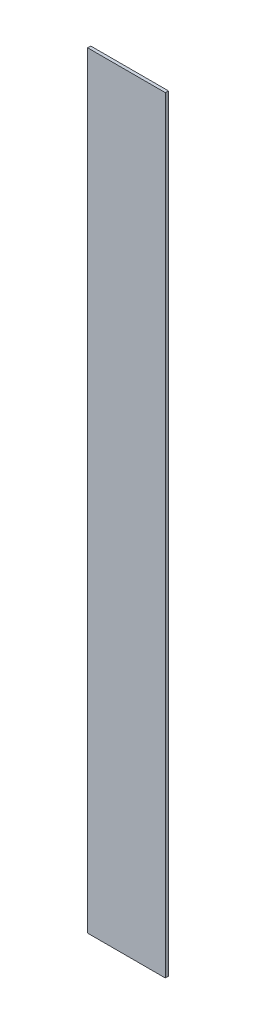
ISO-10303-21;
HEADER;
FILE_DESCRIPTION(('STEP AP214'),'2;1');
FILE_NAME('part.step','',(''),(''),'','','');
FILE_SCHEMA(('AUTOMOTIVE_DESIGN { 1 0 10303 214 1 1 1 1 }'));
ENDSEC;
DATA;
#1=APPLICATION_CONTEXT('core data for automotive mechanical design processes');
#2=APPLICATION_PROTOCOL_DEFINITION('international standard','automotive_design',2000,#1);
#3=PRODUCT_CONTEXT('',#1,'mechanical');
#4=PRODUCT('Part','Part','',(#3));
#5=PRODUCT_RELATED_PRODUCT_CATEGORY('part','',(#4));
#6=PRODUCT_DEFINITION_FORMATION('','',#4);
#7=PRODUCT_DEFINITION_CONTEXT('part definition',#1,'design');
#8=PRODUCT_DEFINITION('design','',#6,#7);
#9=PRODUCT_DEFINITION_SHAPE('','',#8);
#10=(LENGTH_UNIT() NAMED_UNIT(*) SI_UNIT(.MILLI.,.METRE.));
#11=(NAMED_UNIT(*) PLANE_ANGLE_UNIT() SI_UNIT($,.RADIAN.));
#12=(NAMED_UNIT(*) SI_UNIT($,.STERADIAN.) SOLID_ANGLE_UNIT());
#13=UNCERTAINTY_MEASURE_WITH_UNIT(LENGTH_MEASURE(1.E-05),#10,'distance_accuracy_value','');
#14=(GEOMETRIC_REPRESENTATION_CONTEXT(3) GLOBAL_UNCERTAINTY_ASSIGNED_CONTEXT((#13)) GLOBAL_UNIT_ASSIGNED_CONTEXT((#10,
#11,#12)) REPRESENTATION_CONTEXT('',''));
#15=CARTESIAN_POINT('',(0.,0.,0.));
#16=DIRECTION('',(0.,0.,1.));
#17=DIRECTION('',(1.,0.,0.));
#18=AXIS2_PLACEMENT_3D('',#15,#16,#17);
#19=CARTESIAN_POINT('',(25.3999996185303,25.3999996185303,0.));
#20=DIRECTION('',(0.,1.,0.));
#21=DIRECTION('',(1.,0.,0.));
#22=AXIS2_PLACEMENT_3D('',#19,#20,#21);
#23=PLANE('',#22);
#24=DIRECTION('',(1.,0.,0.));
#25=VECTOR('',#24,1.);
#26=CARTESIAN_POINT('',(25.3999996185303,25.3999996185303,0.41148));
#27=LINE('',#26,#25);
#28=CARTESIAN_POINT('',(25.3999996185303,25.3999996185303,0.41148));
#29=VERTEX_POINT('',#28);
#30=CARTESIAN_POINT('',(35.6870002746582,25.3999996185303,0.41148));
#31=VERTEX_POINT('',#30);
#32=EDGE_CURVE('E10',#29,#31,#27,.T.);
#33=ORIENTED_EDGE('',*,*,#32,.F.);
#34=DIRECTION('',(0.,0.,1.));
#35=VECTOR('',#34,1.);
#36=CARTESIAN_POINT('',(25.3999996185303,25.3999996185303,0.));
#37=LINE('',#36,#35);
#38=CARTESIAN_POINT('',(25.3999996185303,25.3999996185303,0.));
#39=VERTEX_POINT('',#38);
#40=EDGE_CURVE('E23',#39,#29,#37,.T.);
#41=ORIENTED_EDGE('',*,*,#40,.F.);
#42=DIRECTION('',(1.,0.,0.));
#43=VECTOR('',#42,1.);
#44=CARTESIAN_POINT('',(25.3999996185303,25.3999996185303,0.));
#45=LINE('',#44,#43);
#46=CARTESIAN_POINT('',(35.6870002746582,25.3999996185303,0.));
#47=VERTEX_POINT('',#46);
#48=EDGE_CURVE('E74',#39,#47,#45,.T.);
#49=ORIENTED_EDGE('',*,*,#48,.T.);
#50=DIRECTION('',(0.,0.,1.));
#51=VECTOR('',#50,1.);
#52=CARTESIAN_POINT('',(35.6870002746582,25.3999996185303,0.));
#53=LINE('',#52,#51);
#54=EDGE_CURVE('E36',#47,#31,#53,.T.);
#55=ORIENTED_EDGE('',*,*,#54,.T.);
#56=EDGE_LOOP('',(#33,#41,#49,#55));
#57=FACE_BOUND('',#56,.T.);
#58=ADVANCED_FACE('F16',(#57),#23,.F.);
#59=CARTESIAN_POINT('',(35.6870002746582,25.3999996185303,0.));
#60=DIRECTION('',(-1.,0.,0.));
#61=DIRECTION('',(0.,1.,0.));
#62=AXIS2_PLACEMENT_3D('',#59,#60,#61);
#63=PLANE('',#62);
#64=DIRECTION('',(0.,1.,0.));
#65=VECTOR('',#64,1.);
#66=CARTESIAN_POINT('',(35.6870002746582,25.3999996185303,0.41148));
#67=LINE('',#66,#65);
#68=CARTESIAN_POINT('',(35.6870002746582,127.,0.41148));
#69=VERTEX_POINT('',#68);
#70=EDGE_CURVE('E82',#31,#69,#67,.T.);
#71=ORIENTED_EDGE('',*,*,#70,.F.);
#72=ORIENTED_EDGE('',*,*,#54,.F.);
#73=DIRECTION('',(0.,1.,0.));
#74=VECTOR('',#73,1.);
#75=CARTESIAN_POINT('',(35.6870002746582,25.3999996185303,0.));
#76=LINE('',#75,#74);
#77=CARTESIAN_POINT('',(35.6870002746582,127.,0.));
#78=VERTEX_POINT('',#77);
#79=EDGE_CURVE('E80',#47,#78,#76,.T.);
#80=ORIENTED_EDGE('',*,*,#79,.T.);
#81=DIRECTION('',(0.,0.,1.));
#82=VECTOR('',#81,1.);
#83=CARTESIAN_POINT('',(35.6870002746582,127.,0.));
#84=LINE('',#83,#82);
#85=EDGE_CURVE('E66',#78,#69,#84,.T.);
#86=ORIENTED_EDGE('',*,*,#85,.T.);
#87=EDGE_LOOP('',(#71,#72,#80,#86));
#88=FACE_BOUND('',#87,.T.);
#89=ADVANCED_FACE('F88',(#88),#63,.F.);
#90=CARTESIAN_POINT('',(35.6870002746582,127.,0.));
#91=DIRECTION('',(0.,-1.,0.));
#92=DIRECTION('',(-1.,0.,0.));
#93=AXIS2_PLACEMENT_3D('',#90,#91,#92);
#94=PLANE('',#93);
#95=DIRECTION('',(-1.,0.,0.));
#96=VECTOR('',#95,1.);
#97=CARTESIAN_POINT('',(35.6870002746582,127.,0.41148));
#98=LINE('',#97,#96);
#99=CARTESIAN_POINT('',(25.3999996185303,127.,0.41148));
#100=VERTEX_POINT('',#99);
#101=EDGE_CURVE('E70',#69,#100,#98,.T.);
#102=ORIENTED_EDGE('',*,*,#101,.F.);
#103=ORIENTED_EDGE('',*,*,#85,.F.);
#104=DIRECTION('',(-1.,0.,0.));
#105=VECTOR('',#104,1.);
#106=CARTESIAN_POINT('',(35.6870002746582,127.,0.));
#107=LINE('',#106,#105);
#108=CARTESIAN_POINT('',(25.3999996185303,127.,0.));
#109=VERTEX_POINT('',#108);
#110=EDGE_CURVE('E62',#78,#109,#107,.T.);
#111=ORIENTED_EDGE('',*,*,#110,.T.);
#112=DIRECTION('',(0.,0.,1.));
#113=VECTOR('',#112,1.);
#114=CARTESIAN_POINT('',(25.3999996185303,127.,0.));
#115=LINE('',#114,#113);
#116=EDGE_CURVE('E52',#109,#100,#115,.T.);
#117=ORIENTED_EDGE('',*,*,#116,.T.);
#118=EDGE_LOOP('',(#102,#103,#111,#117));
#119=FACE_BOUND('',#118,.T.);
#120=ADVANCED_FACE('F65',(#119),#94,.F.);
#121=CARTESIAN_POINT('',(25.3999996185303,127.,0.));
#122=DIRECTION('',(1.,0.,0.));
#123=DIRECTION('',(0.,-1.,0.));
#124=AXIS2_PLACEMENT_3D('',#121,#122,#123);
#125=PLANE('',#124);
#126=DIRECTION('',(0.,-1.,0.));
#127=VECTOR('',#126,1.);
#128=CARTESIAN_POINT('',(25.3999996185303,127.,0.41148));
#129=LINE('',#128,#127);
#130=EDGE_CURVE('E58',#100,#29,#129,.T.);
#131=ORIENTED_EDGE('',*,*,#130,.F.);
#132=ORIENTED_EDGE('',*,*,#116,.F.);
#133=DIRECTION('',(0.,-1.,0.));
#134=VECTOR('',#133,1.);
#135=CARTESIAN_POINT('',(25.3999996185303,127.,0.));
#136=LINE('',#135,#134);
#137=EDGE_CURVE('E56',#109,#39,#136,.T.);
#138=ORIENTED_EDGE('',*,*,#137,.T.);
#139=ORIENTED_EDGE('',*,*,#40,.T.);
#140=EDGE_LOOP('',(#131,#132,#138,#139));
#141=FACE_BOUND('',#140,.T.);
#142=ADVANCED_FACE('F54',(#141),#125,.F.);
#143=CARTESIAN_POINT('',(30.5434999465942,76.1999998092651,0.));
#144=DIRECTION('',(0.,0.,1.));
#145=DIRECTION('',(1.,0.,0.));
#146=AXIS2_PLACEMENT_3D('',#143,#144,#145);
#147=PLANE('',#146);
#148=ORIENTED_EDGE('',*,*,#137,.F.);
#149=ORIENTED_EDGE('',*,*,#110,.F.);
#150=ORIENTED_EDGE('',*,*,#79,.F.);
#151=ORIENTED_EDGE('',*,*,#48,.F.);
#152=EDGE_LOOP('',(#148,#149,#150,#151));
#153=FACE_BOUND('',#152,.T.);
#154=ADVANCED_FACE('F73',(#153),#147,.F.);
#155=CARTESIAN_POINT('',(30.5434999465942,76.1999998092651,0.41148));
#156=DIRECTION('',(0.,0.,1.));
#157=DIRECTION('',(1.,0.,0.));
#158=AXIS2_PLACEMENT_3D('',#155,#156,#157);
#159=PLANE('',#158);
#160=ORIENTED_EDGE('',*,*,#32,.T.);
#161=ORIENTED_EDGE('',*,*,#70,.T.);
#162=ORIENTED_EDGE('',*,*,#101,.T.);
#163=ORIENTED_EDGE('',*,*,#130,.T.);
#164=EDGE_LOOP('',(#160,#161,#162,#163));
#165=FACE_BOUND('',#164,.T.);
#166=ADVANCED_FACE('F90',(#165),#159,.T.);
#167=CLOSED_SHELL('',(#58,#89,#120,#142,#154,#166));
#168=MANIFOLD_SOLID_BREP('B1',#167);
#169=ADVANCED_BREP_SHAPE_REPRESENTATION('',(#18,#168),#14);
#170=SHAPE_DEFINITION_REPRESENTATION(#9,#169);
ENDSEC;
END-ISO-10303-21;
